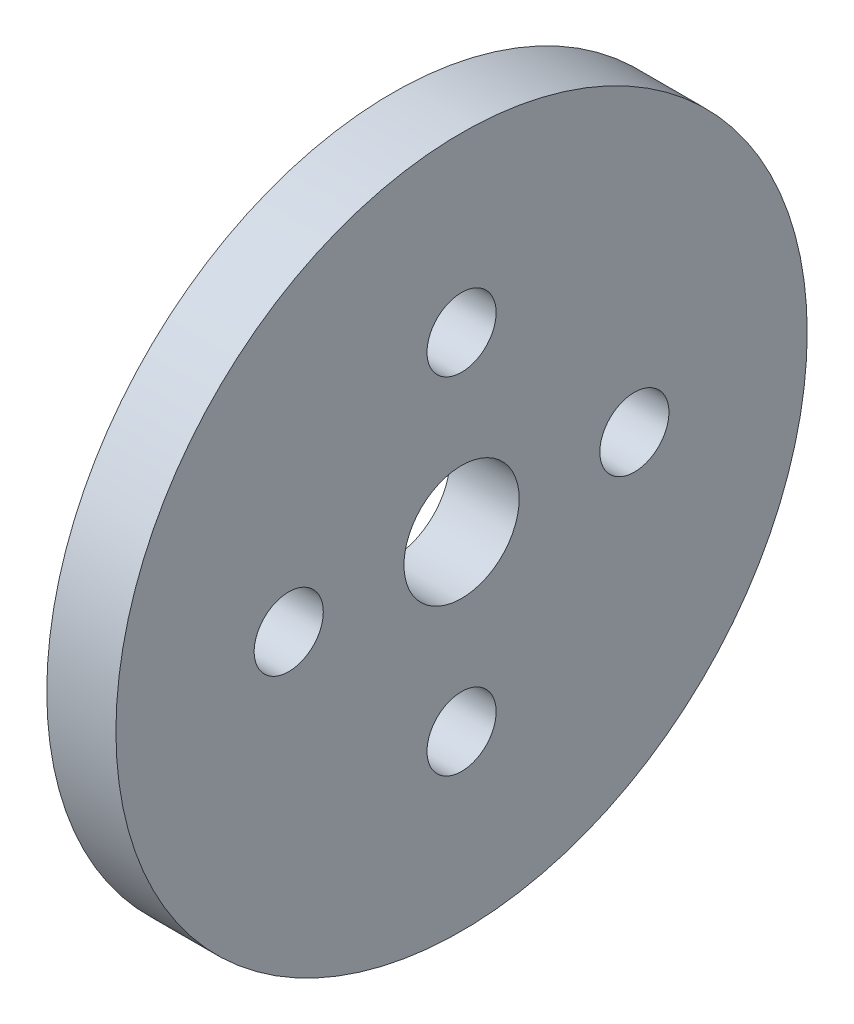
ISO-10303-21;
HEADER;
FILE_DESCRIPTION(('STEP AP214'),'2;1');
FILE_NAME('part.step','',(''),(''),'','','');
FILE_SCHEMA(('AUTOMOTIVE_DESIGN { 1 0 10303 214 1 1 1 1 }'));
ENDSEC;
DATA;
#1=APPLICATION_CONTEXT('core data for automotive mechanical design processes');
#2=APPLICATION_PROTOCOL_DEFINITION('international standard','automotive_design',2000,#1);
#3=PRODUCT_CONTEXT('',#1,'mechanical');
#4=PRODUCT('Part','Part','',(#3));
#5=PRODUCT_RELATED_PRODUCT_CATEGORY('part','',(#4));
#6=PRODUCT_DEFINITION_FORMATION('','',#4);
#7=PRODUCT_DEFINITION_CONTEXT('part definition',#1,'design');
#8=PRODUCT_DEFINITION('design','',#6,#7);
#9=PRODUCT_DEFINITION_SHAPE('','',#8);
#10=(LENGTH_UNIT() NAMED_UNIT(*) SI_UNIT(.MILLI.,.METRE.));
#11=(NAMED_UNIT(*) PLANE_ANGLE_UNIT() SI_UNIT($,.RADIAN.));
#12=(NAMED_UNIT(*) SI_UNIT($,.STERADIAN.) SOLID_ANGLE_UNIT());
#13=UNCERTAINTY_MEASURE_WITH_UNIT(LENGTH_MEASURE(1.E-05),#10,'distance_accuracy_value','');
#14=(GEOMETRIC_REPRESENTATION_CONTEXT(3) GLOBAL_UNCERTAINTY_ASSIGNED_CONTEXT((#13)) GLOBAL_UNIT_ASSIGNED_CONTEXT((#10,
#11,#12)) REPRESENTATION_CONTEXT('',''));
#15=CARTESIAN_POINT('',(0.,0.,0.));
#16=DIRECTION('',(0.,0.,1.));
#17=DIRECTION('',(1.,0.,0.));
#18=AXIS2_PLACEMENT_3D('',#15,#16,#17);
#19=CARTESIAN_POINT('',(3.,0.,0.));
#20=DIRECTION('',(1.,0.,0.));
#21=DIRECTION('',(0.,0.,-1.));
#22=AXIS2_PLACEMENT_3D('',#19,#20,#21);
#23=PLANE('',#22);
#24=CARTESIAN_POINT('',(3.,-7.5,-8.48058857415318E-13));
#25=DIRECTION('',(1.,0.,0.));
#26=DIRECTION('',(0.,0.,-1.));
#27=AXIS2_PLACEMENT_3D('',#24,#25,#26);
#28=CIRCLE('',#27,1.5);
#29=CARTESIAN_POINT('',(3.,-7.5,-1.50000000000085));
#30=VERTEX_POINT('',#29);
#31=EDGE_CURVE('E58',#30,#30,#28,.T.);
#32=ORIENTED_EDGE('',*,*,#31,.F.);
#33=EDGE_LOOP('',(#32));
#34=FACE_BOUND('',#33,.T.);
#35=CARTESIAN_POINT('',(3.,7.5,0.));
#36=DIRECTION('',(1.,0.,0.));
#37=DIRECTION('',(0.,0.,-1.));
#38=AXIS2_PLACEMENT_3D('',#35,#36,#37);
#39=CIRCLE('',#38,1.5);
#40=CARTESIAN_POINT('',(3.,7.5,-1.5));
#41=VERTEX_POINT('',#40);
#42=EDGE_CURVE('E46',#41,#41,#39,.T.);
#43=ORIENTED_EDGE('',*,*,#42,.F.);
#44=EDGE_LOOP('',(#43));
#45=FACE_BOUND('',#44,.T.);
#46=CARTESIAN_POINT('',(3.,0.,0.));
#47=DIRECTION('',(1.,0.,0.));
#48=DIRECTION('',(0.,0.,-1.));
#49=AXIS2_PLACEMENT_3D('',#46,#47,#48);
#50=CIRCLE('',#49,15.);
#51=CARTESIAN_POINT('',(3.,0.,-15.));
#52=VERTEX_POINT('',#51);
#53=EDGE_CURVE('E10',#52,#52,#50,.T.);
#54=ORIENTED_EDGE('',*,*,#53,.T.);
#55=EDGE_LOOP('',(#54));
#56=FACE_BOUND('',#55,.T.);
#57=CARTESIAN_POINT('',(3.,0.,0.));
#58=DIRECTION('',(1.,0.,0.));
#59=DIRECTION('',(0.,0.,-1.));
#60=AXIS2_PLACEMENT_3D('',#57,#58,#59);
#61=CIRCLE('',#60,2.5);
#62=CARTESIAN_POINT('',(3.,0.,-2.5));
#63=VERTEX_POINT('',#62);
#64=EDGE_CURVE('E41',#63,#63,#61,.T.);
#65=ORIENTED_EDGE('',*,*,#64,.F.);
#66=EDGE_LOOP('',(#65));
#67=FACE_BOUND('',#66,.T.);
#68=CARTESIAN_POINT('',(3.,4.24029428707659E-13,-7.50000000000042));
#69=DIRECTION('',(1.,0.,0.));
#70=DIRECTION('',(0.,0.,-1.));
#71=AXIS2_PLACEMENT_3D('',#68,#69,#70);
#72=CIRCLE('',#71,1.5);
#73=CARTESIAN_POINT('',(3.,4.24029428707659E-13,-9.00000000000042));
#74=VERTEX_POINT('',#73);
#75=EDGE_CURVE('E52',#74,#74,#72,.T.);
#76=ORIENTED_EDGE('',*,*,#75,.F.);
#77=EDGE_LOOP('',(#76));
#78=FACE_BOUND('',#77,.T.);
#79=CARTESIAN_POINT('',(3.,-4.24947913807019E-13,7.49999999999958));
#80=DIRECTION('',(1.,0.,0.));
#81=DIRECTION('',(0.,0.,-1.));
#82=AXIS2_PLACEMENT_3D('',#79,#80,#81);
#83=CIRCLE('',#82,1.5);
#84=CARTESIAN_POINT('',(3.,-4.24947913807019E-13,5.99999999999958));
#85=VERTEX_POINT('',#84);
#86=EDGE_CURVE('E64',#85,#85,#83,.T.);
#87=ORIENTED_EDGE('',*,*,#86,.F.);
#88=EDGE_LOOP('',(#87));
#89=FACE_BOUND('',#88,.T.);
#90=ADVANCED_FACE('F30',(#34,#45,#56,#67,#78,#89),#23,.T.);
#91=CARTESIAN_POINT('',(0.,0.,0.));
#92=DIRECTION('',(1.,0.,0.));
#93=DIRECTION('',(0.,0.,-1.));
#94=AXIS2_PLACEMENT_3D('',#91,#92,#93);
#95=PLANE('',#94);
#96=CARTESIAN_POINT('',(0.,-7.5,-8.48058857415318E-13));
#97=DIRECTION('',(1.,0.,0.));
#98=DIRECTION('',(0.,0.,-1.));
#99=AXIS2_PLACEMENT_3D('',#96,#97,#98);
#100=CIRCLE('',#99,1.5);
#101=CARTESIAN_POINT('',(0.,-7.5,-1.50000000000085));
#102=VERTEX_POINT('',#101);
#103=EDGE_CURVE('E61',#102,#102,#100,.T.);
#104=ORIENTED_EDGE('',*,*,#103,.T.);
#105=EDGE_LOOP('',(#104));
#106=FACE_BOUND('',#105,.T.);
#107=CARTESIAN_POINT('',(0.,7.5,0.));
#108=DIRECTION('',(1.,0.,0.));
#109=DIRECTION('',(0.,0.,-1.));
#110=AXIS2_PLACEMENT_3D('',#107,#108,#109);
#111=CIRCLE('',#110,1.5);
#112=CARTESIAN_POINT('',(0.,7.5,-1.5));
#113=VERTEX_POINT('',#112);
#114=EDGE_CURVE('E49',#113,#113,#111,.T.);
#115=ORIENTED_EDGE('',*,*,#114,.T.);
#116=EDGE_LOOP('',(#115));
#117=FACE_BOUND('',#116,.T.);
#118=CARTESIAN_POINT('',(0.,0.,0.));
#119=DIRECTION('',(1.,0.,0.));
#120=DIRECTION('',(0.,0.,-1.));
#121=AXIS2_PLACEMENT_3D('',#118,#119,#120);
#122=CIRCLE('',#121,15.);
#123=CARTESIAN_POINT('',(0.,0.,-15.));
#124=VERTEX_POINT('',#123);
#125=EDGE_CURVE('E34',#124,#124,#122,.T.);
#126=ORIENTED_EDGE('',*,*,#125,.F.);
#127=EDGE_LOOP('',(#126));
#128=FACE_BOUND('',#127,.T.);
#129=CARTESIAN_POINT('',(0.,0.,0.));
#130=DIRECTION('',(1.,0.,0.));
#131=DIRECTION('',(0.,0.,-1.));
#132=AXIS2_PLACEMENT_3D('',#129,#130,#131);
#133=CIRCLE('',#132,2.5);
#134=CARTESIAN_POINT('',(0.,0.,-2.5));
#135=VERTEX_POINT('',#134);
#136=EDGE_CURVE('E43',#135,#135,#133,.T.);
#137=ORIENTED_EDGE('',*,*,#136,.T.);
#138=EDGE_LOOP('',(#137));
#139=FACE_BOUND('',#138,.T.);
#140=CARTESIAN_POINT('',(0.,4.24029428707659E-13,-7.50000000000042));
#141=DIRECTION('',(1.,0.,0.));
#142=DIRECTION('',(0.,0.,-1.));
#143=AXIS2_PLACEMENT_3D('',#140,#141,#142);
#144=CIRCLE('',#143,1.5);
#145=CARTESIAN_POINT('',(0.,4.24029428707659E-13,-9.00000000000042));
#146=VERTEX_POINT('',#145);
#147=EDGE_CURVE('E55',#146,#146,#144,.T.);
#148=ORIENTED_EDGE('',*,*,#147,.T.);
#149=EDGE_LOOP('',(#148));
#150=FACE_BOUND('',#149,.T.);
#151=CARTESIAN_POINT('',(0.,-4.24947913807019E-13,7.49999999999958));
#152=DIRECTION('',(1.,0.,0.));
#153=DIRECTION('',(0.,0.,-1.));
#154=AXIS2_PLACEMENT_3D('',#151,#152,#153);
#155=CIRCLE('',#154,1.5);
#156=CARTESIAN_POINT('',(0.,-4.24947913807019E-13,5.99999999999958));
#157=VERTEX_POINT('',#156);
#158=EDGE_CURVE('E67',#157,#157,#155,.T.);
#159=ORIENTED_EDGE('',*,*,#158,.T.);
#160=EDGE_LOOP('',(#159));
#161=FACE_BOUND('',#160,.T.);
#162=ADVANCED_FACE('F77',(#106,#117,#128,#139,#150,#161),#95,.F.);
#163=CARTESIAN_POINT('',(3.,0.,0.));
#164=DIRECTION('',(-1.,0.,0.));
#165=DIRECTION('',(0.,0.,1.));
#166=AXIS2_PLACEMENT_3D('',#163,#164,#165);
#167=CYLINDRICAL_SURFACE('',#166,15.);
#168=ORIENTED_EDGE('',*,*,#53,.F.);
#169=EDGE_LOOP('',(#168));
#170=FACE_BOUND('',#169,.T.);
#171=ORIENTED_EDGE('',*,*,#125,.T.);
#172=EDGE_LOOP('',(#171));
#173=FACE_BOUND('',#172,.T.);
#174=ADVANCED_FACE('F32',(#170,#173),#167,.T.);
#175=CARTESIAN_POINT('',(3.,0.,0.));
#176=DIRECTION('',(-1.,0.,0.));
#177=DIRECTION('',(0.,0.,1.));
#178=AXIS2_PLACEMENT_3D('',#175,#176,#177);
#179=CYLINDRICAL_SURFACE('',#178,2.5);
#180=ORIENTED_EDGE('',*,*,#64,.T.);
#181=EDGE_LOOP('',(#180));
#182=FACE_BOUND('',#181,.T.);
#183=ORIENTED_EDGE('',*,*,#136,.F.);
#184=EDGE_LOOP('',(#183));
#185=FACE_BOUND('',#184,.T.);
#186=ADVANCED_FACE('F87',(#182,#185),#179,.F.);
#187=CARTESIAN_POINT('',(3.,7.5,0.));
#188=DIRECTION('',(-1.,0.,0.));
#189=DIRECTION('',(0.,0.,1.));
#190=AXIS2_PLACEMENT_3D('',#187,#188,#189);
#191=CYLINDRICAL_SURFACE('',#190,1.5);
#192=ORIENTED_EDGE('',*,*,#42,.T.);
#193=EDGE_LOOP('',(#192));
#194=FACE_BOUND('',#193,.T.);
#195=ORIENTED_EDGE('',*,*,#114,.F.);
#196=EDGE_LOOP('',(#195));
#197=FACE_BOUND('',#196,.T.);
#198=ADVANCED_FACE('F90',(#194,#197),#191,.F.);
#199=CARTESIAN_POINT('',(3.,4.24029428707659E-13,-7.50000000000042));
#200=DIRECTION('',(-1.,0.,0.));
#201=DIRECTION('',(0.,0.,1.));
#202=AXIS2_PLACEMENT_3D('',#199,#200,#201);
#203=CYLINDRICAL_SURFACE('',#202,1.5);
#204=ORIENTED_EDGE('',*,*,#75,.T.);
#205=EDGE_LOOP('',(#204));
#206=FACE_BOUND('',#205,.T.);
#207=ORIENTED_EDGE('',*,*,#147,.F.);
#208=EDGE_LOOP('',(#207));
#209=FACE_BOUND('',#208,.T.);
#210=ADVANCED_FACE('F94',(#206,#209),#203,.F.);
#211=CARTESIAN_POINT('',(3.,-7.5,-8.48058857415318E-13));
#212=DIRECTION('',(-1.,0.,0.));
#213=DIRECTION('',(0.,0.,1.));
#214=AXIS2_PLACEMENT_3D('',#211,#212,#213);
#215=CYLINDRICAL_SURFACE('',#214,1.5);
#216=ORIENTED_EDGE('',*,*,#31,.T.);
#217=EDGE_LOOP('',(#216));
#218=FACE_BOUND('',#217,.T.);
#219=ORIENTED_EDGE('',*,*,#103,.F.);
#220=EDGE_LOOP('',(#219));
#221=FACE_BOUND('',#220,.T.);
#222=ADVANCED_FACE('F98',(#218,#221),#215,.F.);
#223=CARTESIAN_POINT('',(3.,-4.24947913807019E-13,7.49999999999958));
#224=DIRECTION('',(-1.,0.,0.));
#225=DIRECTION('',(0.,0.,1.));
#226=AXIS2_PLACEMENT_3D('',#223,#224,#225);
#227=CYLINDRICAL_SURFACE('',#226,1.5);
#228=ORIENTED_EDGE('',*,*,#86,.T.);
#229=EDGE_LOOP('',(#228));
#230=FACE_BOUND('',#229,.T.);
#231=ORIENTED_EDGE('',*,*,#158,.F.);
#232=EDGE_LOOP('',(#231));
#233=FACE_BOUND('',#232,.T.);
#234=ADVANCED_FACE('F73',(#230,#233),#227,.F.);
#235=CLOSED_SHELL('',(#90,#162,#174,#186,#198,#210,#222,#234));
#236=MANIFOLD_SOLID_BREP('B2',#235);
#237=ADVANCED_BREP_SHAPE_REPRESENTATION('',(#18,#236),#14);
#238=SHAPE_DEFINITION_REPRESENTATION(#9,#237);
ENDSEC;
END-ISO-10303-21;
